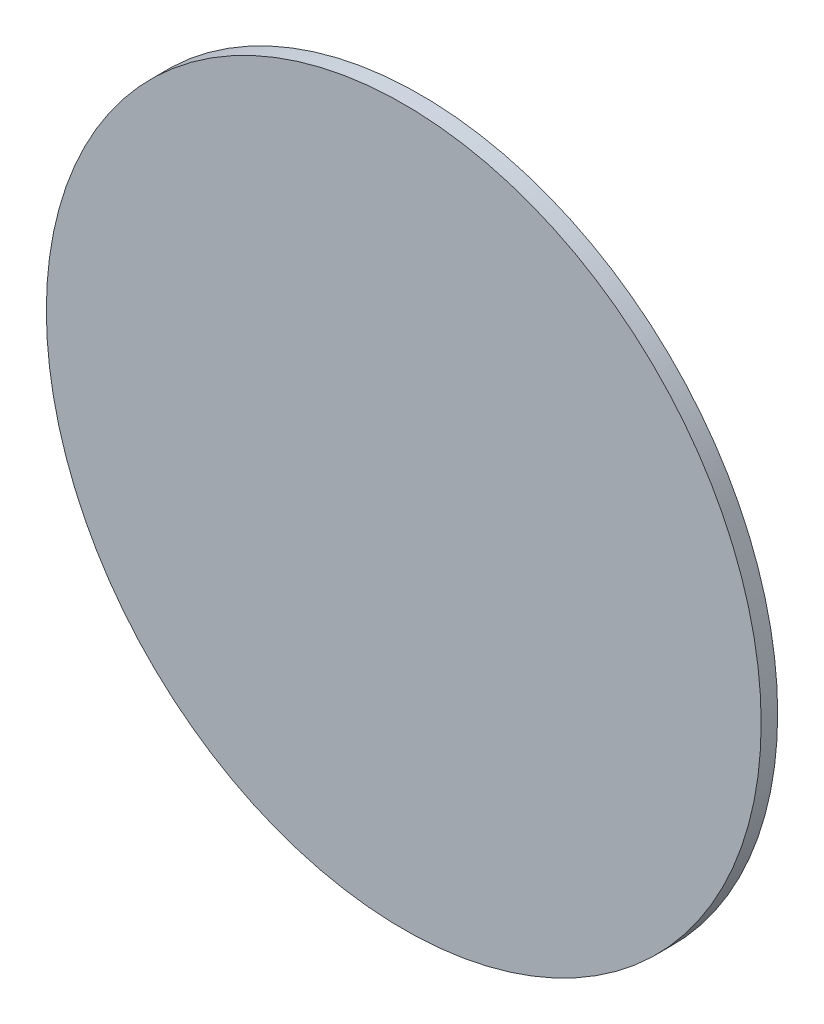
ISO-10303-21;
HEADER;
FILE_DESCRIPTION(('STEP AP214'),'2;1');
FILE_NAME('part.step','',(''),(''),'','','');
FILE_SCHEMA(('AUTOMOTIVE_DESIGN { 1 0 10303 214 1 1 1 1 }'));
ENDSEC;
DATA;
#1=APPLICATION_CONTEXT('core data for automotive mechanical design processes');
#2=APPLICATION_PROTOCOL_DEFINITION('international standard','automotive_design',2000,#1);
#3=PRODUCT_CONTEXT('',#1,'mechanical');
#4=PRODUCT('Part','Part','',(#3));
#5=PRODUCT_RELATED_PRODUCT_CATEGORY('part','',(#4));
#6=PRODUCT_DEFINITION_FORMATION('','',#4);
#7=PRODUCT_DEFINITION_CONTEXT('part definition',#1,'design');
#8=PRODUCT_DEFINITION('design','',#6,#7);
#9=PRODUCT_DEFINITION_SHAPE('','',#8);
#10=(LENGTH_UNIT() NAMED_UNIT(*) SI_UNIT(.MILLI.,.METRE.));
#11=(NAMED_UNIT(*) PLANE_ANGLE_UNIT() SI_UNIT($,.RADIAN.));
#12=(NAMED_UNIT(*) SI_UNIT($,.STERADIAN.) SOLID_ANGLE_UNIT());
#13=UNCERTAINTY_MEASURE_WITH_UNIT(LENGTH_MEASURE(1.E-05),#10,'distance_accuracy_value','');
#14=(GEOMETRIC_REPRESENTATION_CONTEXT(3) GLOBAL_UNCERTAINTY_ASSIGNED_CONTEXT((#13)) GLOBAL_UNIT_ASSIGNED_CONTEXT((#10,
#11,#12)) REPRESENTATION_CONTEXT('',''));
#15=CARTESIAN_POINT('',(0.,0.,0.));
#16=DIRECTION('',(0.,0.,1.));
#17=DIRECTION('',(1.,0.,0.));
#18=AXIS2_PLACEMENT_3D('',#15,#16,#17);
#19=CARTESIAN_POINT('',(0.,0.,3.));
#20=DIRECTION('',(0.,0.,-1.));
#21=DIRECTION('',(-1.,0.,0.));
#22=AXIS2_PLACEMENT_3D('',#19,#20,#21);
#23=CYLINDRICAL_SURFACE('',#22,65.);
#24=CARTESIAN_POINT('',(0.,0.,3.));
#25=DIRECTION('',(0.,0.,1.));
#26=DIRECTION('',(1.,0.,0.));
#27=AXIS2_PLACEMENT_3D('',#24,#25,#26);
#28=CIRCLE('',#27,65.);
#29=CARTESIAN_POINT('',(65.,0.,3.));
#30=VERTEX_POINT('',#29);
#31=EDGE_CURVE('E12',#30,#30,#28,.T.);
#32=ORIENTED_EDGE('',*,*,#31,.F.);
#33=EDGE_LOOP('',(#32));
#34=FACE_BOUND('',#33,.T.);
#35=CARTESIAN_POINT('',(0.,0.,0.));
#36=DIRECTION('',(0.,0.,1.));
#37=DIRECTION('',(1.,0.,0.));
#38=AXIS2_PLACEMENT_3D('',#35,#36,#37);
#39=CIRCLE('',#38,65.);
#40=CARTESIAN_POINT('',(65.,0.,0.));
#41=VERTEX_POINT('',#40);
#42=EDGE_CURVE('E50',#41,#41,#39,.T.);
#43=ORIENTED_EDGE('',*,*,#42,.T.);
#44=EDGE_LOOP('',(#43));
#45=FACE_BOUND('',#44,.T.);
#46=ADVANCED_FACE('F47',(#34,#45),#23,.T.);
#47=CARTESIAN_POINT('',(0.,0.,3.));
#48=DIRECTION('',(0.,0.,1.));
#49=DIRECTION('',(1.,0.,0.));
#50=AXIS2_PLACEMENT_3D('',#47,#48,#49);
#51=PLANE('',#50);
#52=ORIENTED_EDGE('',*,*,#31,.T.);
#53=EDGE_LOOP('',(#52));
#54=FACE_BOUND('',#53,.T.);
#55=ADVANCED_FACE('F66',(#54),#51,.T.);
#56=CARTESIAN_POINT('',(0.,0.,0.));
#57=DIRECTION('',(0.,0.,1.));
#58=DIRECTION('',(1.,0.,0.));
#59=AXIS2_PLACEMENT_3D('',#56,#57,#58);
#60=PLANE('',#59);
#61=ORIENTED_EDGE('',*,*,#42,.F.);
#62=EDGE_LOOP('',(#61));
#63=FACE_BOUND('',#62,.T.);
#64=ADVANCED_FACE('F64',(#63),#60,.F.);
#65=CLOSED_SHELL('',(#46,#55,#64));
#66=MANIFOLD_SOLID_BREP('B2',#65);
#67=ADVANCED_BREP_SHAPE_REPRESENTATION('',(#18,#66),#14);
#68=SHAPE_DEFINITION_REPRESENTATION(#9,#67);
ENDSEC;
END-ISO-10303-21;
